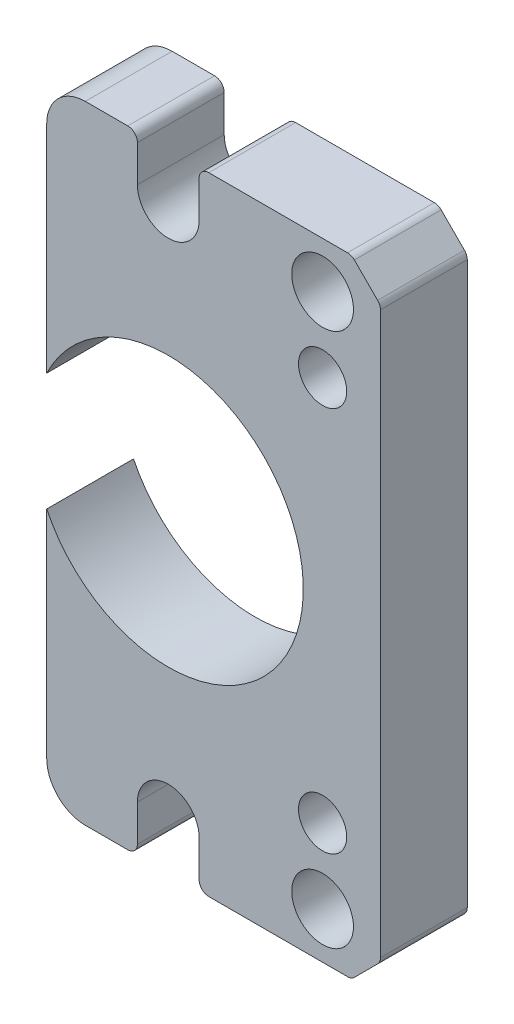
ISO-10303-21;
HEADER;
FILE_DESCRIPTION(('STEP AP214'),'2;1');
FILE_NAME('part.step','',(''),(''),'','','');
FILE_SCHEMA(('AUTOMOTIVE_DESIGN { 1 0 10303 214 1 1 1 1 }'));
ENDSEC;
DATA;
#1=APPLICATION_CONTEXT('core data for automotive mechanical design processes');
#2=APPLICATION_PROTOCOL_DEFINITION('international standard','automotive_design',2000,#1);
#3=PRODUCT_CONTEXT('',#1,'mechanical');
#4=PRODUCT('Part','Part','',(#3));
#5=PRODUCT_RELATED_PRODUCT_CATEGORY('part','',(#4));
#6=PRODUCT_DEFINITION_FORMATION('','',#4);
#7=PRODUCT_DEFINITION_CONTEXT('part definition',#1,'design');
#8=PRODUCT_DEFINITION('design','',#6,#7);
#9=PRODUCT_DEFINITION_SHAPE('','',#8);
#10=(LENGTH_UNIT() NAMED_UNIT(*) SI_UNIT(.MILLI.,.METRE.));
#11=(NAMED_UNIT(*) PLANE_ANGLE_UNIT() SI_UNIT($,.RADIAN.));
#12=(NAMED_UNIT(*) SI_UNIT($,.STERADIAN.) SOLID_ANGLE_UNIT());
#13=UNCERTAINTY_MEASURE_WITH_UNIT(LENGTH_MEASURE(1.E-05),#10,'distance_accuracy_value','');
#14=(GEOMETRIC_REPRESENTATION_CONTEXT(3) GLOBAL_UNCERTAINTY_ASSIGNED_CONTEXT((#13)) GLOBAL_UNIT_ASSIGNED_CONTEXT((#10,
#11,#12)) REPRESENTATION_CONTEXT('',''));
#15=CARTESIAN_POINT('',(0.,0.,0.));
#16=DIRECTION('',(0.,0.,1.));
#17=DIRECTION('',(1.,0.,0.));
#18=AXIS2_PLACEMENT_3D('',#15,#16,#17);
#19=CARTESIAN_POINT('',(10.5,-14.5428932188134,0.));
#20=DIRECTION('',(0.,0.,-1.));
#21=DIRECTION('',(-1.,0.,0.));
#22=AXIS2_PLACEMENT_3D('',#19,#20,#21);
#23=CYLINDRICAL_SURFACE('',#22,0.500000000000017);
#24=CARTESIAN_POINT('',(10.5,-14.5428932188134,-4.5));
#25=DIRECTION('',(0.,0.,-1.));
#26=DIRECTION('',(-1.,0.,0.));
#27=AXIS2_PLACEMENT_3D('',#24,#25,#26);
#28=CIRCLE('',#27,0.500000000000017);
#29=CARTESIAN_POINT('',(11.,-14.5428932188134,-4.5));
#30=VERTEX_POINT('',#29);
#31=CARTESIAN_POINT('',(10.8535533905933,-14.8964466094067,-4.5));
#32=VERTEX_POINT('',#31);
#33=EDGE_CURVE('E258',#30,#32,#28,.T.);
#34=ORIENTED_EDGE('',*,*,#33,.F.);
#35=DIRECTION('',(0.,0.,-1.));
#36=VECTOR('',#35,1.);
#37=CARTESIAN_POINT('',(11.,-14.5428932188134,0.));
#38=LINE('',#37,#36);
#39=CARTESIAN_POINT('',(11.,-14.5428932188134,0.));
#40=VERTEX_POINT('',#39);
#41=EDGE_CURVE('E215',#40,#30,#38,.T.);
#42=ORIENTED_EDGE('',*,*,#41,.F.);
#43=CARTESIAN_POINT('',(10.5,-14.5428932188134,0.));
#44=DIRECTION('',(0.,0.,-1.));
#45=DIRECTION('',(-1.,0.,0.));
#46=AXIS2_PLACEMENT_3D('',#43,#44,#45);
#47=CIRCLE('',#46,0.500000000000017);
#48=CARTESIAN_POINT('',(10.8535533905933,-14.8964466094067,0.));
#49=VERTEX_POINT('',#48);
#50=EDGE_CURVE('E261',#40,#49,#47,.T.);
#51=ORIENTED_EDGE('',*,*,#50,.T.);
#52=DIRECTION('',(0.,0.,-1.));
#53=VECTOR('',#52,1.);
#54=CARTESIAN_POINT('',(10.8535533905933,-14.8964466094067,0.));
#55=LINE('',#54,#53);
#56=EDGE_CURVE('E324',#49,#32,#55,.T.);
#57=ORIENTED_EDGE('',*,*,#56,.T.);
#58=EDGE_LOOP('',(#34,#42,#51,#57));
#59=FACE_BOUND('',#58,.T.);
#60=ADVANCED_FACE('F35',(#59),#23,.T.);
#61=CARTESIAN_POINT('',(11.,14.5428932188134,0.));
#62=DIRECTION('',(1.,0.,0.));
#63=DIRECTION('',(0.,0.,-1.));
#64=AXIS2_PLACEMENT_3D('',#61,#62,#63);
#65=PLANE('',#64);
#66=DIRECTION('',(0.,-1.,0.));
#67=VECTOR('',#66,1.);
#68=CARTESIAN_POINT('',(11.,14.5428932188134,-4.5));
#69=LINE('',#68,#67);
#70=CARTESIAN_POINT('',(11.,14.5428932188134,-4.5));
#71=VERTEX_POINT('',#70);
#72=EDGE_CURVE('E265',#71,#30,#69,.T.);
#73=ORIENTED_EDGE('',*,*,#72,.F.);
#74=DIRECTION('',(0.,0.,-1.));
#75=VECTOR('',#74,1.);
#76=CARTESIAN_POINT('',(11.,14.5428932188134,0.));
#77=LINE('',#76,#75);
#78=CARTESIAN_POINT('',(11.,14.5428932188134,0.));
#79=VERTEX_POINT('',#78);
#80=EDGE_CURVE('E386',#79,#71,#77,.T.);
#81=ORIENTED_EDGE('',*,*,#80,.F.);
#82=DIRECTION('',(0.,-1.,0.));
#83=VECTOR('',#82,1.);
#84=CARTESIAN_POINT('',(11.,14.5428932188134,0.));
#85=LINE('',#84,#83);
#86=EDGE_CURVE('E321',#79,#40,#85,.T.);
#87=ORIENTED_EDGE('',*,*,#86,.T.);
#88=ORIENTED_EDGE('',*,*,#41,.T.);
#89=EDGE_LOOP('',(#73,#81,#87,#88));
#90=FACE_BOUND('',#89,.T.);
#91=ADVANCED_FACE('F482',(#90),#65,.T.);
#92=CARTESIAN_POINT('',(10.5,14.5428932188134,0.));
#93=DIRECTION('',(0.,0.,-1.));
#94=DIRECTION('',(-1.,0.,0.));
#95=AXIS2_PLACEMENT_3D('',#92,#93,#94);
#96=CYLINDRICAL_SURFACE('',#95,0.500000000000017);
#97=CARTESIAN_POINT('',(10.5,14.5428932188134,-4.5));
#98=DIRECTION('',(0.,0.,-1.));
#99=DIRECTION('',(-1.,0.,0.));
#100=AXIS2_PLACEMENT_3D('',#97,#98,#99);
#101=CIRCLE('',#100,0.500000000000017);
#102=CARTESIAN_POINT('',(10.8535533905933,14.8964466094067,-4.5));
#103=VERTEX_POINT('',#102);
#104=EDGE_CURVE('E380',#103,#71,#101,.T.);
#105=ORIENTED_EDGE('',*,*,#104,.F.);
#106=DIRECTION('',(0.,0.,-1.));
#107=VECTOR('',#106,1.);
#108=CARTESIAN_POINT('',(10.8535533905933,14.8964466094067,0.));
#109=LINE('',#108,#107);
#110=CARTESIAN_POINT('',(10.8535533905933,14.8964466094067,0.));
#111=VERTEX_POINT('',#110);
#112=EDGE_CURVE('E388',#111,#103,#109,.T.);
#113=ORIENTED_EDGE('',*,*,#112,.F.);
#114=CARTESIAN_POINT('',(10.5,14.5428932188134,0.));
#115=DIRECTION('',(0.,0.,-1.));
#116=DIRECTION('',(-1.,0.,0.));
#117=AXIS2_PLACEMENT_3D('',#114,#115,#116);
#118=CIRCLE('',#117,0.500000000000017);
#119=EDGE_CURVE('E318',#111,#79,#118,.T.);
#120=ORIENTED_EDGE('',*,*,#119,.T.);
#121=ORIENTED_EDGE('',*,*,#80,.T.);
#122=EDGE_LOOP('',(#105,#113,#120,#121));
#123=FACE_BOUND('',#122,.T.);
#124=ADVANCED_FACE('F479',(#123),#96,.T.);
#125=CARTESIAN_POINT('',(9.64644660940672,16.1035533905933,0.));
#126=DIRECTION('',(0.707106781186554,0.707106781186541,0.));
#127=DIRECTION('',(-0.707106781186541,0.707106781186554,0.));
#128=AXIS2_PLACEMENT_3D('',#125,#126,#127);
#129=PLANE('',#128);
#130=DIRECTION('',(0.707106781186541,-0.707106781186554,0.));
#131=VECTOR('',#130,1.);
#132=CARTESIAN_POINT('',(9.64644660940672,16.1035533905933,-4.5));
#133=LINE('',#132,#131);
#134=CARTESIAN_POINT('',(9.64644660940672,16.1035533905933,-4.5));
#135=VERTEX_POINT('',#134);
#136=EDGE_CURVE('E377',#135,#103,#133,.T.);
#137=ORIENTED_EDGE('',*,*,#136,.F.);
#138=DIRECTION('',(0.,0.,-1.));
#139=VECTOR('',#138,1.);
#140=CARTESIAN_POINT('',(9.64644660940672,16.1035533905933,0.));
#141=LINE('',#140,#139);
#142=CARTESIAN_POINT('',(9.64644660940672,16.1035533905933,0.));
#143=VERTEX_POINT('',#142);
#144=EDGE_CURVE('E390',#143,#135,#141,.T.);
#145=ORIENTED_EDGE('',*,*,#144,.F.);
#146=DIRECTION('',(0.707106781186541,-0.707106781186554,0.));
#147=VECTOR('',#146,1.);
#148=CARTESIAN_POINT('',(9.64644660940672,16.1035533905933,0.));
#149=LINE('',#148,#147);
#150=EDGE_CURVE('E315',#143,#111,#149,.T.);
#151=ORIENTED_EDGE('',*,*,#150,.T.);
#152=ORIENTED_EDGE('',*,*,#112,.T.);
#153=EDGE_LOOP('',(#137,#145,#151,#152));
#154=FACE_BOUND('',#153,.T.);
#155=ADVANCED_FACE('F475',(#154),#129,.T.);
#156=CARTESIAN_POINT('',(9.29289321881345,15.75,0.));
#157=DIRECTION('',(0.,0.,-1.));
#158=DIRECTION('',(-1.,0.,0.));
#159=AXIS2_PLACEMENT_3D('',#156,#157,#158);
#160=CYLINDRICAL_SURFACE('',#159,0.500000000000008);
#161=CARTESIAN_POINT('',(9.29289321881345,15.75,-4.5));
#162=DIRECTION('',(0.,0.,-1.));
#163=DIRECTION('',(-1.,0.,0.));
#164=AXIS2_PLACEMENT_3D('',#161,#162,#163);
#165=CIRCLE('',#164,0.500000000000008);
#166=CARTESIAN_POINT('',(9.29289321881345,16.25,-4.5));
#167=VERTEX_POINT('',#166);
#168=EDGE_CURVE('E374',#167,#135,#165,.T.);
#169=ORIENTED_EDGE('',*,*,#168,.F.);
#170=DIRECTION('',(0.,0.,-1.));
#171=VECTOR('',#170,1.);
#172=CARTESIAN_POINT('',(9.29289321881345,16.25,0.));
#173=LINE('',#172,#171);
#174=CARTESIAN_POINT('',(9.29289321881345,16.25,0.));
#175=VERTEX_POINT('',#174);
#176=EDGE_CURVE('E392',#175,#167,#173,.T.);
#177=ORIENTED_EDGE('',*,*,#176,.F.);
#178=CARTESIAN_POINT('',(9.29289321881345,15.75,0.));
#179=DIRECTION('',(0.,0.,-1.));
#180=DIRECTION('',(-1.,0.,0.));
#181=AXIS2_PLACEMENT_3D('',#178,#179,#180);
#182=CIRCLE('',#181,0.500000000000008);
#183=EDGE_CURVE('E312',#175,#143,#182,.T.);
#184=ORIENTED_EDGE('',*,*,#183,.T.);
#185=ORIENTED_EDGE('',*,*,#144,.T.);
#186=EDGE_LOOP('',(#169,#177,#184,#185));
#187=FACE_BOUND('',#186,.T.);
#188=ADVANCED_FACE('F470',(#187),#160,.T.);
#189=CARTESIAN_POINT('',(2.1,16.25,0.));
#190=DIRECTION('',(0.,1.,0.));
#191=DIRECTION('',(0.,0.,1.));
#192=AXIS2_PLACEMENT_3D('',#189,#190,#191);
#193=PLANE('',#192);
#194=DIRECTION('',(1.,0.,0.));
#195=VECTOR('',#194,1.);
#196=CARTESIAN_POINT('',(2.1,16.25,-4.5));
#197=LINE('',#196,#195);
#198=CARTESIAN_POINT('',(2.1,16.25,-4.5));
#199=VERTEX_POINT('',#198);
#200=EDGE_CURVE('E371',#199,#167,#197,.T.);
#201=ORIENTED_EDGE('',*,*,#200,.F.);
#202=DIRECTION('',(0.,0.,-1.));
#203=VECTOR('',#202,1.);
#204=CARTESIAN_POINT('',(2.1,16.25,0.));
#205=LINE('',#204,#203);
#206=CARTESIAN_POINT('',(2.1,16.25,0.));
#207=VERTEX_POINT('',#206);
#208=EDGE_CURVE('E394',#207,#199,#205,.T.);
#209=ORIENTED_EDGE('',*,*,#208,.F.);
#210=DIRECTION('',(1.,0.,0.));
#211=VECTOR('',#210,1.);
#212=CARTESIAN_POINT('',(2.1,16.25,0.));
#213=LINE('',#212,#211);
#214=EDGE_CURVE('E309',#207,#175,#213,.T.);
#215=ORIENTED_EDGE('',*,*,#214,.T.);
#216=ORIENTED_EDGE('',*,*,#176,.T.);
#217=EDGE_LOOP('',(#201,#209,#215,#216));
#218=FACE_BOUND('',#217,.T.);
#219=ADVANCED_FACE('F466',(#218),#193,.T.);
#220=CARTESIAN_POINT('',(2.1,15.75,0.));
#221=DIRECTION('',(0.,0.,-1.));
#222=DIRECTION('',(-1.,0.,0.));
#223=AXIS2_PLACEMENT_3D('',#220,#221,#222);
#224=CYLINDRICAL_SURFACE('',#223,0.5);
#225=CARTESIAN_POINT('',(2.1,15.75,-4.5));
#226=DIRECTION('',(0.,0.,-1.));
#227=DIRECTION('',(-1.,0.,0.));
#228=AXIS2_PLACEMENT_3D('',#225,#226,#227);
#229=CIRCLE('',#228,0.5);
#230=CARTESIAN_POINT('',(1.6,15.75,-4.5));
#231=VERTEX_POINT('',#230);
#232=EDGE_CURVE('E368',#231,#199,#229,.T.);
#233=ORIENTED_EDGE('',*,*,#232,.F.);
#234=DIRECTION('',(0.,0.,-1.));
#235=VECTOR('',#234,1.);
#236=CARTESIAN_POINT('',(1.6,15.75,0.));
#237=LINE('',#236,#235);
#238=CARTESIAN_POINT('',(1.6,15.75,0.));
#239=VERTEX_POINT('',#238);
#240=EDGE_CURVE('E396',#239,#231,#237,.T.);
#241=ORIENTED_EDGE('',*,*,#240,.F.);
#242=CARTESIAN_POINT('',(2.1,15.75,0.));
#243=DIRECTION('',(0.,0.,-1.));
#244=DIRECTION('',(-1.,0.,0.));
#245=AXIS2_PLACEMENT_3D('',#242,#243,#244);
#246=CIRCLE('',#245,0.5);
#247=EDGE_CURVE('E306',#239,#207,#246,.T.);
#248=ORIENTED_EDGE('',*,*,#247,.T.);
#249=ORIENTED_EDGE('',*,*,#208,.T.);
#250=EDGE_LOOP('',(#233,#241,#248,#249));
#251=FACE_BOUND('',#250,.T.);
#252=ADVANCED_FACE('F462',(#251),#224,.T.);
#253=CARTESIAN_POINT('',(1.6,13.856406460551,0.));
#254=DIRECTION('',(-1.,0.,0.));
#255=DIRECTION('',(0.,0.,1.));
#256=AXIS2_PLACEMENT_3D('',#253,#254,#255);
#257=PLANE('',#256);
#258=DIRECTION('',(0.,1.,0.));
#259=VECTOR('',#258,1.);
#260=CARTESIAN_POINT('',(1.6,13.856406460551,-4.5));
#261=LINE('',#260,#259);
#262=CARTESIAN_POINT('',(1.6,13.856406460551,-4.5));
#263=VERTEX_POINT('',#262);
#264=EDGE_CURVE('E365',#263,#231,#261,.T.);
#265=ORIENTED_EDGE('',*,*,#264,.F.);
#266=DIRECTION('',(0.,0.,-1.));
#267=VECTOR('',#266,1.);
#268=CARTESIAN_POINT('',(1.6,13.856406460551,0.));
#269=LINE('',#268,#267);
#270=CARTESIAN_POINT('',(1.6,13.856406460551,0.));
#271=VERTEX_POINT('',#270);
#272=EDGE_CURVE('E398',#271,#263,#269,.T.);
#273=ORIENTED_EDGE('',*,*,#272,.F.);
#274=DIRECTION('',(0.,1.,0.));
#275=VECTOR('',#274,1.);
#276=CARTESIAN_POINT('',(1.6,13.856406460551,0.));
#277=LINE('',#276,#275);
#278=EDGE_CURVE('E303',#271,#239,#277,.T.);
#279=ORIENTED_EDGE('',*,*,#278,.T.);
#280=ORIENTED_EDGE('',*,*,#240,.T.);
#281=EDGE_LOOP('',(#265,#273,#279,#280));
#282=FACE_BOUND('',#281,.T.);
#283=ADVANCED_FACE('F458',(#282),#257,.T.);
#284=CARTESIAN_POINT('',(0.,13.856406460551,0.));
#285=DIRECTION('',(0.,0.,-1.));
#286=DIRECTION('',(-1.,0.,0.));
#287=AXIS2_PLACEMENT_3D('',#284,#285,#286);
#288=CYLINDRICAL_SURFACE('',#287,1.6);
#289=CARTESIAN_POINT('',(0.,13.856406460551,-4.5));
#290=DIRECTION('',(0.,0.,1.));
#291=DIRECTION('',(1.,0.,0.));
#292=AXIS2_PLACEMENT_3D('',#289,#290,#291);
#293=CIRCLE('',#292,1.6);
#294=CARTESIAN_POINT('',(-1.6,13.856406460551,-4.5));
#295=VERTEX_POINT('',#294);
#296=EDGE_CURVE('E362',#295,#263,#293,.T.);
#297=ORIENTED_EDGE('',*,*,#296,.F.);
#298=DIRECTION('',(0.,0.,-1.));
#299=VECTOR('',#298,1.);
#300=CARTESIAN_POINT('',(-1.6,13.856406460551,0.));
#301=LINE('',#300,#299);
#302=CARTESIAN_POINT('',(-1.6,13.856406460551,0.));
#303=VERTEX_POINT('',#302);
#304=EDGE_CURVE('E400',#303,#295,#301,.T.);
#305=ORIENTED_EDGE('',*,*,#304,.F.);
#306=CARTESIAN_POINT('',(0.,13.856406460551,0.));
#307=DIRECTION('',(0.,0.,1.));
#308=DIRECTION('',(1.,0.,0.));
#309=AXIS2_PLACEMENT_3D('',#306,#307,#308);
#310=CIRCLE('',#309,1.6);
#311=EDGE_CURVE('E300',#303,#271,#310,.T.);
#312=ORIENTED_EDGE('',*,*,#311,.T.);
#313=ORIENTED_EDGE('',*,*,#272,.T.);
#314=EDGE_LOOP('',(#297,#305,#312,#313));
#315=FACE_BOUND('',#314,.T.);
#316=ADVANCED_FACE('F454',(#315),#288,.F.);
#317=CARTESIAN_POINT('',(-1.6,15.75,0.));
#318=DIRECTION('',(1.,0.,0.));
#319=DIRECTION('',(0.,0.,-1.));
#320=AXIS2_PLACEMENT_3D('',#317,#318,#319);
#321=PLANE('',#320);
#322=DIRECTION('',(0.,-1.,0.));
#323=VECTOR('',#322,1.);
#324=CARTESIAN_POINT('',(-1.6,15.75,-4.5));
#325=LINE('',#324,#323);
#326=CARTESIAN_POINT('',(-1.6,15.75,-4.5));
#327=VERTEX_POINT('',#326);
#328=EDGE_CURVE('E359',#327,#295,#325,.T.);
#329=ORIENTED_EDGE('',*,*,#328,.F.);
#330=DIRECTION('',(0.,0.,-1.));
#331=VECTOR('',#330,1.);
#332=CARTESIAN_POINT('',(-1.6,15.75,0.));
#333=LINE('',#332,#331);
#334=CARTESIAN_POINT('',(-1.6,15.75,0.));
#335=VERTEX_POINT('',#334);
#336=EDGE_CURVE('E402',#335,#327,#333,.T.);
#337=ORIENTED_EDGE('',*,*,#336,.F.);
#338=DIRECTION('',(0.,-1.,0.));
#339=VECTOR('',#338,1.);
#340=CARTESIAN_POINT('',(-1.6,15.75,0.));
#341=LINE('',#340,#339);
#342=EDGE_CURVE('E297',#335,#303,#341,.T.);
#343=ORIENTED_EDGE('',*,*,#342,.T.);
#344=ORIENTED_EDGE('',*,*,#304,.T.);
#345=EDGE_LOOP('',(#329,#337,#343,#344));
#346=FACE_BOUND('',#345,.T.);
#347=ADVANCED_FACE('F452',(#346),#321,.T.);
#348=CARTESIAN_POINT('',(-2.1,15.75,0.));
#349=DIRECTION('',(0.,0.,-1.));
#350=DIRECTION('',(-1.,0.,0.));
#351=AXIS2_PLACEMENT_3D('',#348,#349,#350);
#352=CYLINDRICAL_SURFACE('',#351,0.5);
#353=CARTESIAN_POINT('',(-2.1,15.75,-4.5));
#354=DIRECTION('',(0.,0.,-1.));
#355=DIRECTION('',(-1.,0.,0.));
#356=AXIS2_PLACEMENT_3D('',#353,#354,#355);
#357=CIRCLE('',#356,0.5);
#358=CARTESIAN_POINT('',(-2.1,16.25,-4.5));
#359=VERTEX_POINT('',#358);
#360=EDGE_CURVE('E356',#359,#327,#357,.T.);
#361=ORIENTED_EDGE('',*,*,#360,.F.);
#362=DIRECTION('',(0.,0.,-1.));
#363=VECTOR('',#362,1.);
#364=CARTESIAN_POINT('',(-2.1,16.25,0.));
#365=LINE('',#364,#363);
#366=CARTESIAN_POINT('',(-2.1,16.25,0.));
#367=VERTEX_POINT('',#366);
#368=EDGE_CURVE('E404',#367,#359,#365,.T.);
#369=ORIENTED_EDGE('',*,*,#368,.F.);
#370=CARTESIAN_POINT('',(-2.1,15.75,0.));
#371=DIRECTION('',(0.,0.,-1.));
#372=DIRECTION('',(-1.,0.,0.));
#373=AXIS2_PLACEMENT_3D('',#370,#371,#372);
#374=CIRCLE('',#373,0.5);
#375=EDGE_CURVE('E294',#367,#335,#374,.T.);
#376=ORIENTED_EDGE('',*,*,#375,.T.);
#377=ORIENTED_EDGE('',*,*,#336,.T.);
#378=EDGE_LOOP('',(#361,#369,#376,#377));
#379=FACE_BOUND('',#378,.T.);
#380=ADVANCED_FACE('F446',(#379),#352,.T.);
#381=CARTESIAN_POINT('',(-9.29289321881346,16.25,0.));
#382=DIRECTION('',(0.,1.,0.));
#383=DIRECTION('',(0.,0.,1.));
#384=AXIS2_PLACEMENT_3D('',#381,#382,#383);
#385=PLANE('',#384);
#386=DIRECTION('',(1.,0.,0.));
#387=VECTOR('',#386,1.);
#388=CARTESIAN_POINT('',(-9.29289321881346,16.25,-4.5));
#389=LINE('',#388,#387);
#390=CARTESIAN_POINT('',(-4.30090089148444,16.25,-4.5));
#391=VERTEX_POINT('',#390);
#392=EDGE_CURVE('E354',#391,#359,#389,.T.);
#393=ORIENTED_EDGE('',*,*,#392,.F.);
#394=DIRECTION('',(0.,0.,1.));
#395=VECTOR('',#394,1.);
#396=CARTESIAN_POINT('',(-4.30090089148444,16.25,0.));
#397=LINE('',#396,#395);
#398=CARTESIAN_POINT('',(-4.30090089148444,16.25,0.));
#399=VERTEX_POINT('',#398);
#400=EDGE_CURVE('E43',#391,#399,#397,.T.);
#401=ORIENTED_EDGE('',*,*,#400,.T.);
#402=DIRECTION('',(1.,0.,0.));
#403=VECTOR('',#402,1.);
#404=CARTESIAN_POINT('',(-9.29289321881346,16.25,0.));
#405=LINE('',#404,#403);
#406=EDGE_CURVE('E292',#399,#367,#405,.T.);
#407=ORIENTED_EDGE('',*,*,#406,.T.);
#408=ORIENTED_EDGE('',*,*,#368,.T.);
#409=EDGE_LOOP('',(#393,#401,#407,#408));
#410=FACE_BOUND('',#409,.T.);
#411=ADVANCED_FACE('F438',(#410),#385,.T.);
#412=CARTESIAN_POINT('',(-2.1,-16.25,0.));
#413=DIRECTION('',(0.,-1.,0.));
#414=DIRECTION('',(0.,0.,-1.));
#415=AXIS2_PLACEMENT_3D('',#412,#413,#414);
#416=PLANE('',#415);
#417=DIRECTION('',(-1.,0.,0.));
#418=VECTOR('',#417,1.);
#419=CARTESIAN_POINT('',(-2.1,-16.25,0.));
#420=LINE('',#419,#418);
#421=CARTESIAN_POINT('',(-2.1,-16.25,0.));
#422=VERTEX_POINT('',#421);
#423=CARTESIAN_POINT('',(-4.30090089148444,-16.25,0.));
#424=VERTEX_POINT('',#423);
#425=EDGE_CURVE('E289',#422,#424,#420,.T.);
#426=ORIENTED_EDGE('',*,*,#425,.T.);
#427=DIRECTION('',(0.,0.,1.));
#428=VECTOR('',#427,1.);
#429=CARTESIAN_POINT('',(-4.30090089148444,-16.25,-4.5));
#430=LINE('',#429,#428);
#431=CARTESIAN_POINT('',(-4.30090089148444,-16.25,-4.5));
#432=VERTEX_POINT('',#431);
#433=EDGE_CURVE('E431',#424,#432,#430,.F.);
#434=ORIENTED_EDGE('',*,*,#433,.T.);
#435=DIRECTION('',(-1.,0.,0.));
#436=VECTOR('',#435,1.);
#437=CARTESIAN_POINT('',(-2.1,-16.25,-4.5));
#438=LINE('',#437,#436);
#439=CARTESIAN_POINT('',(-2.1,-16.25,-4.5));
#440=VERTEX_POINT('',#439);
#441=EDGE_CURVE('E351',#440,#432,#438,.T.);
#442=ORIENTED_EDGE('',*,*,#441,.F.);
#443=DIRECTION('',(0.,0.,-1.));
#444=VECTOR('',#443,1.);
#445=CARTESIAN_POINT('',(-2.1,-16.25,0.));
#446=LINE('',#445,#444);
#447=EDGE_CURVE('E407',#422,#440,#446,.T.);
#448=ORIENTED_EDGE('',*,*,#447,.F.);
#449=EDGE_LOOP('',(#426,#434,#442,#448));
#450=FACE_BOUND('',#449,.T.);
#451=ADVANCED_FACE('F556',(#450),#416,.T.);
#452=CARTESIAN_POINT('',(-2.1,-15.75,0.));
#453=DIRECTION('',(0.,0.,-1.));
#454=DIRECTION('',(-1.,0.,0.));
#455=AXIS2_PLACEMENT_3D('',#452,#453,#454);
#456=CYLINDRICAL_SURFACE('',#455,0.5);
#457=CARTESIAN_POINT('',(-2.1,-15.75,-4.5));
#458=DIRECTION('',(0.,0.,-1.));
#459=DIRECTION('',(-1.,0.,0.));
#460=AXIS2_PLACEMENT_3D('',#457,#458,#459);
#461=CIRCLE('',#460,0.5);
#462=CARTESIAN_POINT('',(-1.6,-15.75,-4.5));
#463=VERTEX_POINT('',#462);
#464=EDGE_CURVE('E348',#463,#440,#461,.T.);
#465=ORIENTED_EDGE('',*,*,#464,.F.);
#466=DIRECTION('',(0.,0.,-1.));
#467=VECTOR('',#466,1.);
#468=CARTESIAN_POINT('',(-1.6,-15.75,0.));
#469=LINE('',#468,#467);
#470=CARTESIAN_POINT('',(-1.6,-15.75,0.));
#471=VERTEX_POINT('',#470);
#472=EDGE_CURVE('E409',#471,#463,#469,.T.);
#473=ORIENTED_EDGE('',*,*,#472,.F.);
#474=CARTESIAN_POINT('',(-2.1,-15.75,0.));
#475=DIRECTION('',(0.,0.,-1.));
#476=DIRECTION('',(-1.,0.,0.));
#477=AXIS2_PLACEMENT_3D('',#474,#475,#476);
#478=CIRCLE('',#477,0.5);
#479=EDGE_CURVE('E286',#471,#422,#478,.T.);
#480=ORIENTED_EDGE('',*,*,#479,.T.);
#481=ORIENTED_EDGE('',*,*,#447,.T.);
#482=EDGE_LOOP('',(#465,#473,#480,#481));
#483=FACE_BOUND('',#482,.T.);
#484=ADVANCED_FACE('F517',(#483),#456,.T.);
#485=CARTESIAN_POINT('',(-1.6,-13.856406460551,0.));
#486=DIRECTION('',(1.,0.,0.));
#487=DIRECTION('',(0.,0.,-1.));
#488=AXIS2_PLACEMENT_3D('',#485,#486,#487);
#489=PLANE('',#488);
#490=DIRECTION('',(0.,-1.,0.));
#491=VECTOR('',#490,1.);
#492=CARTESIAN_POINT('',(-1.6,-13.856406460551,-4.5));
#493=LINE('',#492,#491);
#494=CARTESIAN_POINT('',(-1.6,-13.856406460551,-4.5));
#495=VERTEX_POINT('',#494);
#496=EDGE_CURVE('E345',#495,#463,#493,.T.);
#497=ORIENTED_EDGE('',*,*,#496,.F.);
#498=DIRECTION('',(0.,0.,-1.));
#499=VECTOR('',#498,1.);
#500=CARTESIAN_POINT('',(-1.6,-13.856406460551,0.));
#501=LINE('',#500,#499);
#502=CARTESIAN_POINT('',(-1.6,-13.856406460551,0.));
#503=VERTEX_POINT('',#502);
#504=EDGE_CURVE('E411',#503,#495,#501,.T.);
#505=ORIENTED_EDGE('',*,*,#504,.F.);
#506=DIRECTION('',(0.,-1.,0.));
#507=VECTOR('',#506,1.);
#508=CARTESIAN_POINT('',(-1.6,-13.856406460551,0.));
#509=LINE('',#508,#507);
#510=EDGE_CURVE('E283',#503,#471,#509,.T.);
#511=ORIENTED_EDGE('',*,*,#510,.T.);
#512=ORIENTED_EDGE('',*,*,#472,.T.);
#513=EDGE_LOOP('',(#497,#505,#511,#512));
#514=FACE_BOUND('',#513,.T.);
#515=ADVANCED_FACE('F513',(#514),#489,.T.);
#516=CARTESIAN_POINT('',(0.,-13.856406460551,0.));
#517=DIRECTION('',(0.,0.,-1.));
#518=DIRECTION('',(-1.,0.,0.));
#519=AXIS2_PLACEMENT_3D('',#516,#517,#518);
#520=CYLINDRICAL_SURFACE('',#519,1.6);
#521=CARTESIAN_POINT('',(0.,-13.856406460551,-4.5));
#522=DIRECTION('',(0.,0.,1.));
#523=DIRECTION('',(1.,0.,0.));
#524=AXIS2_PLACEMENT_3D('',#521,#522,#523);
#525=CIRCLE('',#524,1.6);
#526=CARTESIAN_POINT('',(1.6,-13.856406460551,-4.5));
#527=VERTEX_POINT('',#526);
#528=EDGE_CURVE('E342',#527,#495,#525,.T.);
#529=ORIENTED_EDGE('',*,*,#528,.F.);
#530=DIRECTION('',(0.,0.,-1.));
#531=VECTOR('',#530,1.);
#532=CARTESIAN_POINT('',(1.6,-13.856406460551,0.));
#533=LINE('',#532,#531);
#534=CARTESIAN_POINT('',(1.6,-13.856406460551,0.));
#535=VERTEX_POINT('',#534);
#536=EDGE_CURVE('E413',#535,#527,#533,.T.);
#537=ORIENTED_EDGE('',*,*,#536,.F.);
#538=CARTESIAN_POINT('',(0.,-13.856406460551,0.));
#539=DIRECTION('',(0.,0.,1.));
#540=DIRECTION('',(1.,0.,0.));
#541=AXIS2_PLACEMENT_3D('',#538,#539,#540);
#542=CIRCLE('',#541,1.6);
#543=EDGE_CURVE('E280',#535,#503,#542,.T.);
#544=ORIENTED_EDGE('',*,*,#543,.T.);
#545=ORIENTED_EDGE('',*,*,#504,.T.);
#546=EDGE_LOOP('',(#529,#537,#544,#545));
#547=FACE_BOUND('',#546,.T.);
#548=ADVANCED_FACE('F509',(#547),#520,.F.);
#549=CARTESIAN_POINT('',(1.6,-15.75,0.));
#550=DIRECTION('',(-1.,0.,0.));
#551=DIRECTION('',(0.,0.,1.));
#552=AXIS2_PLACEMENT_3D('',#549,#550,#551);
#553=PLANE('',#552);
#554=DIRECTION('',(0.,1.,0.));
#555=VECTOR('',#554,1.);
#556=CARTESIAN_POINT('',(1.6,-15.75,-4.5));
#557=LINE('',#556,#555);
#558=CARTESIAN_POINT('',(1.6,-15.75,-4.5));
#559=VERTEX_POINT('',#558);
#560=EDGE_CURVE('E339',#559,#527,#557,.T.);
#561=ORIENTED_EDGE('',*,*,#560,.F.);
#562=DIRECTION('',(0.,0.,-1.));
#563=VECTOR('',#562,1.);
#564=CARTESIAN_POINT('',(1.6,-15.75,0.));
#565=LINE('',#564,#563);
#566=CARTESIAN_POINT('',(1.6,-15.75,0.));
#567=VERTEX_POINT('',#566);
#568=EDGE_CURVE('E415',#567,#559,#565,.T.);
#569=ORIENTED_EDGE('',*,*,#568,.F.);
#570=DIRECTION('',(0.,1.,0.));
#571=VECTOR('',#570,1.);
#572=CARTESIAN_POINT('',(1.6,-15.75,0.));
#573=LINE('',#572,#571);
#574=EDGE_CURVE('E277',#567,#535,#573,.T.);
#575=ORIENTED_EDGE('',*,*,#574,.T.);
#576=ORIENTED_EDGE('',*,*,#536,.T.);
#577=EDGE_LOOP('',(#561,#569,#575,#576));
#578=FACE_BOUND('',#577,.T.);
#579=ADVANCED_FACE('F505',(#578),#553,.T.);
#580=CARTESIAN_POINT('',(2.1,-15.75,0.));
#581=DIRECTION('',(0.,0.,-1.));
#582=DIRECTION('',(-1.,0.,0.));
#583=AXIS2_PLACEMENT_3D('',#580,#581,#582);
#584=CYLINDRICAL_SURFACE('',#583,0.5);
#585=CARTESIAN_POINT('',(2.1,-15.75,-4.5));
#586=DIRECTION('',(0.,0.,-1.));
#587=DIRECTION('',(-1.,0.,0.));
#588=AXIS2_PLACEMENT_3D('',#585,#586,#587);
#589=CIRCLE('',#588,0.5);
#590=CARTESIAN_POINT('',(2.1,-16.25,-4.5));
#591=VERTEX_POINT('',#590);
#592=EDGE_CURVE('E336',#591,#559,#589,.T.);
#593=ORIENTED_EDGE('',*,*,#592,.F.);
#594=DIRECTION('',(0.,0.,-1.));
#595=VECTOR('',#594,1.);
#596=CARTESIAN_POINT('',(2.1,-16.25,0.));
#597=LINE('',#596,#595);
#598=CARTESIAN_POINT('',(2.1,-16.25,0.));
#599=VERTEX_POINT('',#598);
#600=EDGE_CURVE('E417',#599,#591,#597,.T.);
#601=ORIENTED_EDGE('',*,*,#600,.F.);
#602=CARTESIAN_POINT('',(2.1,-15.75,0.));
#603=DIRECTION('',(0.,0.,-1.));
#604=DIRECTION('',(-1.,0.,0.));
#605=AXIS2_PLACEMENT_3D('',#602,#603,#604);
#606=CIRCLE('',#605,0.5);
#607=EDGE_CURVE('E274',#599,#567,#606,.T.);
#608=ORIENTED_EDGE('',*,*,#607,.T.);
#609=ORIENTED_EDGE('',*,*,#568,.T.);
#610=EDGE_LOOP('',(#593,#601,#608,#609));
#611=FACE_BOUND('',#610,.T.);
#612=ADVANCED_FACE('F501',(#611),#584,.T.);
#613=CARTESIAN_POINT('',(9.29289321881345,-16.25,0.));
#614=DIRECTION('',(0.,-1.,0.));
#615=DIRECTION('',(0.,0.,-1.));
#616=AXIS2_PLACEMENT_3D('',#613,#614,#615);
#617=PLANE('',#616);
#618=DIRECTION('',(-1.,0.,0.));
#619=VECTOR('',#618,1.);
#620=CARTESIAN_POINT('',(9.29289321881345,-16.25,-4.5));
#621=LINE('',#620,#619);
#622=CARTESIAN_POINT('',(9.29289321881345,-16.25,-4.5));
#623=VERTEX_POINT('',#622);
#624=EDGE_CURVE('E333',#623,#591,#621,.T.);
#625=ORIENTED_EDGE('',*,*,#624,.F.);
#626=DIRECTION('',(0.,0.,-1.));
#627=VECTOR('',#626,1.);
#628=CARTESIAN_POINT('',(9.29289321881345,-16.25,0.));
#629=LINE('',#628,#627);
#630=CARTESIAN_POINT('',(9.29289321881345,-16.25,0.));
#631=VERTEX_POINT('',#630);
#632=EDGE_CURVE('E419',#631,#623,#629,.T.);
#633=ORIENTED_EDGE('',*,*,#632,.F.);
#634=DIRECTION('',(-1.,0.,0.));
#635=VECTOR('',#634,1.);
#636=CARTESIAN_POINT('',(9.29289321881345,-16.25,0.));
#637=LINE('',#636,#635);
#638=EDGE_CURVE('E271',#631,#599,#637,.T.);
#639=ORIENTED_EDGE('',*,*,#638,.T.);
#640=ORIENTED_EDGE('',*,*,#600,.T.);
#641=EDGE_LOOP('',(#625,#633,#639,#640));
#642=FACE_BOUND('',#641,.T.);
#643=ADVANCED_FACE('F497',(#642),#617,.T.);
#644=CARTESIAN_POINT('',(9.29289321881345,-15.75,0.));
#645=DIRECTION('',(0.,0.,-1.));
#646=DIRECTION('',(-1.,0.,0.));
#647=AXIS2_PLACEMENT_3D('',#644,#645,#646);
#648=CYLINDRICAL_SURFACE('',#647,0.500000000000012);
#649=CARTESIAN_POINT('',(9.29289321881345,-15.75,-4.5));
#650=DIRECTION('',(0.,0.,-1.));
#651=DIRECTION('',(-1.,0.,0.));
#652=AXIS2_PLACEMENT_3D('',#649,#650,#651);
#653=CIRCLE('',#652,0.500000000000012);
#654=CARTESIAN_POINT('',(9.64644660940673,-16.1035533905933,-4.5));
#655=VERTEX_POINT('',#654);
#656=EDGE_CURVE('E330',#655,#623,#653,.T.);
#657=ORIENTED_EDGE('',*,*,#656,.F.);
#658=DIRECTION('',(0.,0.,-1.));
#659=VECTOR('',#658,1.);
#660=CARTESIAN_POINT('',(9.64644660940673,-16.1035533905933,0.));
#661=LINE('',#660,#659);
#662=CARTESIAN_POINT('',(9.64644660940673,-16.1035533905933,0.));
#663=VERTEX_POINT('',#662);
#664=EDGE_CURVE('E421',#663,#655,#661,.T.);
#665=ORIENTED_EDGE('',*,*,#664,.F.);
#666=CARTESIAN_POINT('',(9.29289321881345,-15.75,0.));
#667=DIRECTION('',(0.,0.,-1.));
#668=DIRECTION('',(-1.,0.,0.));
#669=AXIS2_PLACEMENT_3D('',#666,#667,#668);
#670=CIRCLE('',#669,0.500000000000012);
#671=EDGE_CURVE('E268',#663,#631,#670,.T.);
#672=ORIENTED_EDGE('',*,*,#671,.T.);
#673=ORIENTED_EDGE('',*,*,#632,.T.);
#674=EDGE_LOOP('',(#657,#665,#672,#673));
#675=FACE_BOUND('',#674,.T.);
#676=ADVANCED_FACE('F493',(#675),#648,.T.);
#677=CARTESIAN_POINT('',(10.8535533905933,-14.8964466094067,0.));
#678=DIRECTION('',(0.707106781186557,-0.707106781186538,0.));
#679=DIRECTION('',(0.707106781186538,0.707106781186557,0.));
#680=AXIS2_PLACEMENT_3D('',#677,#678,#679);
#681=PLANE('',#680);
#682=DIRECTION('',(-0.707106781186538,-0.707106781186557,0.));
#683=VECTOR('',#682,1.);
#684=CARTESIAN_POINT('',(10.8535533905933,-14.8964466094067,-4.5));
#685=LINE('',#684,#683);
#686=EDGE_CURVE('E327',#32,#655,#685,.T.);
#687=ORIENTED_EDGE('',*,*,#686,.F.);
#688=ORIENTED_EDGE('',*,*,#56,.F.);
#689=DIRECTION('',(-0.707106781186538,-0.707106781186557,0.));
#690=VECTOR('',#689,1.);
#691=CARTESIAN_POINT('',(10.8535533905933,-14.8964466094067,0.));
#692=LINE('',#691,#690);
#693=EDGE_CURVE('E264',#49,#663,#692,.T.);
#694=ORIENTED_EDGE('',*,*,#693,.T.);
#695=ORIENTED_EDGE('',*,*,#664,.T.);
#696=EDGE_LOOP('',(#687,#688,#694,#695));
#697=FACE_BOUND('',#696,.T.);
#698=ADVANCED_FACE('F489',(#697),#681,.T.);
#699=CARTESIAN_POINT('',(10.5,-14.5428932188134,0.));
#700=DIRECTION('',(0.,0.,-1.));
#701=DIRECTION('',(-1.,0.,0.));
#702=AXIS2_PLACEMENT_3D('',#699,#700,#701);
#703=PLANE('',#702);
#704=DIRECTION('',(0.,1.,0.));
#705=VECTOR('',#704,1.);
#706=CARTESIAN_POINT('',(-6.30090089148444,-16.25,0.));
#707=LINE('',#706,#705);
#708=CARTESIAN_POINT('',(-6.30090089148444,-14.25,0.));
#709=VERTEX_POINT('',#708);
#710=CARTESIAN_POINT('',(-6.30090089148444,-3.0493684519406,0.));
#711=VERTEX_POINT('',#710);
#712=EDGE_CURVE('E225',#709,#711,#707,.T.);
#713=ORIENTED_EDGE('',*,*,#712,.F.);
#714=CARTESIAN_POINT('',(-4.30090089148444,-14.25,0.));
#715=DIRECTION('',(0.,0.,-1.));
#716=DIRECTION('',(-1.,0.,0.));
#717=AXIS2_PLACEMENT_3D('',#714,#715,#716);
#718=CIRCLE('',#717,2.);
#719=EDGE_CURVE('E429',#709,#424,#718,.F.);
#720=ORIENTED_EDGE('',*,*,#719,.T.);
#721=ORIENTED_EDGE('',*,*,#425,.F.);
#722=ORIENTED_EDGE('',*,*,#479,.F.);
#723=ORIENTED_EDGE('',*,*,#510,.F.);
#724=ORIENTED_EDGE('',*,*,#543,.F.);
#725=ORIENTED_EDGE('',*,*,#574,.F.);
#726=ORIENTED_EDGE('',*,*,#607,.F.);
#727=ORIENTED_EDGE('',*,*,#638,.F.);
#728=ORIENTED_EDGE('',*,*,#671,.F.);
#729=ORIENTED_EDGE('',*,*,#693,.F.);
#730=ORIENTED_EDGE('',*,*,#50,.F.);
#731=ORIENTED_EDGE('',*,*,#86,.F.);
#732=ORIENTED_EDGE('',*,*,#119,.F.);
#733=ORIENTED_EDGE('',*,*,#150,.F.);
#734=ORIENTED_EDGE('',*,*,#183,.F.);
#735=ORIENTED_EDGE('',*,*,#214,.F.);
#736=ORIENTED_EDGE('',*,*,#247,.F.);
#737=ORIENTED_EDGE('',*,*,#278,.F.);
#738=ORIENTED_EDGE('',*,*,#311,.F.);
#739=ORIENTED_EDGE('',*,*,#342,.F.);
#740=ORIENTED_EDGE('',*,*,#375,.F.);
#741=ORIENTED_EDGE('',*,*,#406,.F.);
#742=CARTESIAN_POINT('',(-4.30090089148444,14.25,0.));
#743=DIRECTION('',(0.,0.,-1.));
#744=DIRECTION('',(-1.,0.,0.));
#745=AXIS2_PLACEMENT_3D('',#742,#743,#744);
#746=CIRCLE('',#745,2.);
#747=CARTESIAN_POINT('',(-6.30090089148444,14.25,0.));
#748=VERTEX_POINT('',#747);
#749=EDGE_CURVE('E224',#399,#748,#746,.F.);
#750=ORIENTED_EDGE('',*,*,#749,.T.);
#751=CARTESIAN_POINT('',(-6.30090089148444,3.0493684519406,0.));
#752=VERTEX_POINT('',#751);
#753=EDGE_CURVE('E208',#752,#748,#707,.T.);
#754=ORIENTED_EDGE('',*,*,#753,.F.);
#755=CARTESIAN_POINT('',(0.,0.,0.));
#756=DIRECTION('',(0.,0.,-1.));
#757=DIRECTION('',(1.,0.,0.));
#758=AXIS2_PLACEMENT_3D('',#755,#756,#757);
#759=CIRCLE('',#758,7.);
#760=EDGE_CURVE('E222',#752,#711,#759,.T.);
#761=ORIENTED_EDGE('',*,*,#760,.T.);
#762=EDGE_LOOP('',(#713,#720,#721,#722,#723,#724,#725,#726,#727,#728,#729,#730,#731,#732,#733,
#734,#735,#736,#737,#738,#739,#740,#741,#750,#754,#761));
#763=FACE_BOUND('',#762,.T.);
#764=CARTESIAN_POINT('',(8.,13.85640646,0.));
#765=DIRECTION('',(0.,0.,-1.));
#766=DIRECTION('',(1.,0.,0.));
#767=AXIS2_PLACEMENT_3D('',#764,#765,#766);
#768=CIRCLE('',#767,1.6);
#769=CARTESIAN_POINT('',(9.6,13.85640646,0.));
#770=VERTEX_POINT('',#769);
#771=EDGE_CURVE('E234',#770,#770,#768,.T.);
#772=ORIENTED_EDGE('',*,*,#771,.T.);
#773=EDGE_LOOP('',(#772));
#774=FACE_BOUND('',#773,.T.);
#775=CARTESIAN_POINT('',(8.,-13.85640646,0.));
#776=DIRECTION('',(0.,0.,-1.));
#777=DIRECTION('',(1.,0.,0.));
#778=AXIS2_PLACEMENT_3D('',#775,#776,#777);
#779=CIRCLE('',#778,1.6);
#780=CARTESIAN_POINT('',(9.6,-13.85640646,0.));
#781=VERTEX_POINT('',#780);
#782=EDGE_CURVE('E243',#781,#781,#779,.T.);
#783=ORIENTED_EDGE('',*,*,#782,.T.);
#784=EDGE_LOOP('',(#783));
#785=FACE_BOUND('',#784,.T.);
#786=CARTESIAN_POINT('',(8.,10.,0.));
#787=DIRECTION('',(0.,0.,-1.));
#788=DIRECTION('',(1.,0.,0.));
#789=AXIS2_PLACEMENT_3D('',#786,#787,#788);
#790=CIRCLE('',#789,1.25);
#791=CARTESIAN_POINT('',(9.25,10.,0.));
#792=VERTEX_POINT('',#791);
#793=EDGE_CURVE('E249',#792,#792,#790,.T.);
#794=ORIENTED_EDGE('',*,*,#793,.T.);
#795=EDGE_LOOP('',(#794));
#796=FACE_BOUND('',#795,.T.);
#797=CARTESIAN_POINT('',(8.,-10.,0.));
#798=DIRECTION('',(0.,0.,-1.));
#799=DIRECTION('',(1.,0.,0.));
#800=AXIS2_PLACEMENT_3D('',#797,#798,#799);
#801=CIRCLE('',#800,1.25);
#802=CARTESIAN_POINT('',(9.25,-10.,0.));
#803=VERTEX_POINT('',#802);
#804=EDGE_CURVE('E255',#803,#803,#801,.T.);
#805=ORIENTED_EDGE('',*,*,#804,.T.);
#806=EDGE_LOOP('',(#805));
#807=FACE_BOUND('',#806,.T.);
#808=ADVANCED_FACE('F220',(#763,#774,#785,#796,#807),#703,.F.);
#809=CARTESIAN_POINT('',(10.5,-14.5428932188134,-4.5));
#810=DIRECTION('',(0.,0.,-1.));
#811=DIRECTION('',(-1.,0.,0.));
#812=AXIS2_PLACEMENT_3D('',#809,#810,#811);
#813=PLANE('',#812);
#814=ORIENTED_EDGE('',*,*,#441,.T.);
#815=CARTESIAN_POINT('',(-4.30090089148444,-14.25,-4.5));
#816=DIRECTION('',(0.,0.,-1.));
#817=DIRECTION('',(-1.,0.,0.));
#818=AXIS2_PLACEMENT_3D('',#815,#816,#817);
#819=CIRCLE('',#818,2.);
#820=CARTESIAN_POINT('',(-6.30090089148444,-14.25,-4.5));
#821=VERTEX_POINT('',#820);
#822=EDGE_CURVE('E434',#432,#821,#819,.T.);
#823=ORIENTED_EDGE('',*,*,#822,.T.);
#824=DIRECTION('',(0.,1.,0.));
#825=VECTOR('',#824,1.);
#826=CARTESIAN_POINT('',(-6.30090089148444,-16.25,-4.5));
#827=LINE('',#826,#825);
#828=CARTESIAN_POINT('',(-6.30090089148444,-3.0493684519406,-4.5));
#829=VERTEX_POINT('',#828);
#830=EDGE_CURVE('E236',#821,#829,#827,.T.);
#831=ORIENTED_EDGE('',*,*,#830,.T.);
#832=CARTESIAN_POINT('',(0.,0.,-4.5));
#833=DIRECTION('',(0.,0.,-1.));
#834=DIRECTION('',(1.,0.,0.));
#835=AXIS2_PLACEMENT_3D('',#832,#833,#834);
#836=CIRCLE('',#835,7.);
#837=CARTESIAN_POINT('',(-6.30090089148444,3.0493684519406,-4.5));
#838=VERTEX_POINT('',#837);
#839=EDGE_CURVE('E231',#838,#829,#836,.T.);
#840=ORIENTED_EDGE('',*,*,#839,.F.);
#841=CARTESIAN_POINT('',(-6.30090089148444,14.25,-4.5));
#842=VERTEX_POINT('',#841);
#843=EDGE_CURVE('E209',#838,#842,#827,.T.);
#844=ORIENTED_EDGE('',*,*,#843,.T.);
#845=CARTESIAN_POINT('',(-4.30090089148444,14.25,-4.5));
#846=DIRECTION('',(0.,0.,-1.));
#847=DIRECTION('',(-1.,0.,0.));
#848=AXIS2_PLACEMENT_3D('',#845,#846,#847);
#849=CIRCLE('',#848,2.);
#850=EDGE_CURVE('E50',#842,#391,#849,.T.);
#851=ORIENTED_EDGE('',*,*,#850,.T.);
#852=ORIENTED_EDGE('',*,*,#392,.T.);
#853=ORIENTED_EDGE('',*,*,#360,.T.);
#854=ORIENTED_EDGE('',*,*,#328,.T.);
#855=ORIENTED_EDGE('',*,*,#296,.T.);
#856=ORIENTED_EDGE('',*,*,#264,.T.);
#857=ORIENTED_EDGE('',*,*,#232,.T.);
#858=ORIENTED_EDGE('',*,*,#200,.T.);
#859=ORIENTED_EDGE('',*,*,#168,.T.);
#860=ORIENTED_EDGE('',*,*,#136,.T.);
#861=ORIENTED_EDGE('',*,*,#104,.T.);
#862=ORIENTED_EDGE('',*,*,#72,.T.);
#863=ORIENTED_EDGE('',*,*,#33,.T.);
#864=ORIENTED_EDGE('',*,*,#686,.T.);
#865=ORIENTED_EDGE('',*,*,#656,.T.);
#866=ORIENTED_EDGE('',*,*,#624,.T.);
#867=ORIENTED_EDGE('',*,*,#592,.T.);
#868=ORIENTED_EDGE('',*,*,#560,.T.);
#869=ORIENTED_EDGE('',*,*,#528,.T.);
#870=ORIENTED_EDGE('',*,*,#496,.T.);
#871=ORIENTED_EDGE('',*,*,#464,.T.);
#872=EDGE_LOOP('',(#814,#823,#831,#840,#844,#851,#852,#853,#854,#855,#856,#857,#858,#859,#860,
#861,#862,#863,#864,#865,#866,#867,#868,#869,#870,#871));
#873=FACE_BOUND('',#872,.T.);
#874=CARTESIAN_POINT('',(8.,13.85640646,-4.5));
#875=DIRECTION('',(0.,0.,-1.));
#876=DIRECTION('',(1.,0.,0.));
#877=AXIS2_PLACEMENT_3D('',#874,#875,#876);
#878=CIRCLE('',#877,1.6);
#879=CARTESIAN_POINT('',(9.6,13.85640646,-4.5));
#880=VERTEX_POINT('',#879);
#881=EDGE_CURVE('E230',#880,#880,#878,.T.);
#882=ORIENTED_EDGE('',*,*,#881,.F.);
#883=EDGE_LOOP('',(#882));
#884=FACE_BOUND('',#883,.T.);
#885=CARTESIAN_POINT('',(8.,-13.85640646,-4.5));
#886=DIRECTION('',(0.,0.,-1.));
#887=DIRECTION('',(1.,0.,0.));
#888=AXIS2_PLACEMENT_3D('',#885,#886,#887);
#889=CIRCLE('',#888,1.6);
#890=CARTESIAN_POINT('',(9.6,-13.85640646,-4.5));
#891=VERTEX_POINT('',#890);
#892=EDGE_CURVE('E241',#891,#891,#889,.T.);
#893=ORIENTED_EDGE('',*,*,#892,.F.);
#894=EDGE_LOOP('',(#893));
#895=FACE_BOUND('',#894,.T.);
#896=CARTESIAN_POINT('',(8.,10.,-4.5));
#897=DIRECTION('',(0.,0.,-1.));
#898=DIRECTION('',(1.,0.,0.));
#899=AXIS2_PLACEMENT_3D('',#896,#897,#898);
#900=CIRCLE('',#899,1.25);
#901=CARTESIAN_POINT('',(9.25,10.,-4.5));
#902=VERTEX_POINT('',#901);
#903=EDGE_CURVE('E246',#902,#902,#900,.T.);
#904=ORIENTED_EDGE('',*,*,#903,.F.);
#905=EDGE_LOOP('',(#904));
#906=FACE_BOUND('',#905,.T.);
#907=CARTESIAN_POINT('',(8.,-10.,-4.5));
#908=DIRECTION('',(0.,0.,-1.));
#909=DIRECTION('',(1.,0.,0.));
#910=AXIS2_PLACEMENT_3D('',#907,#908,#909);
#911=CIRCLE('',#910,1.25);
#912=CARTESIAN_POINT('',(9.25,-10.,-4.5));
#913=VERTEX_POINT('',#912);
#914=EDGE_CURVE('E252',#913,#913,#911,.T.);
#915=ORIENTED_EDGE('',*,*,#914,.F.);
#916=EDGE_LOOP('',(#915));
#917=FACE_BOUND('',#916,.T.);
#918=ADVANCED_FACE('F448',(#873,#884,#895,#906,#917),#813,.T.);
#919=CARTESIAN_POINT('',(8.,-10.,0.));
#920=DIRECTION('',(0.,0.,-1.));
#921=DIRECTION('',(-1.,0.,0.));
#922=AXIS2_PLACEMENT_3D('',#919,#920,#921);
#923=CYLINDRICAL_SURFACE('',#922,1.25);
#924=ORIENTED_EDGE('',*,*,#804,.F.);
#925=EDGE_LOOP('',(#924));
#926=FACE_BOUND('',#925,.T.);
#927=ORIENTED_EDGE('',*,*,#914,.T.);
#928=EDGE_LOOP('',(#927));
#929=FACE_BOUND('',#928,.T.);
#930=ADVANCED_FACE('F581',(#926,#929),#923,.F.);
#931=CARTESIAN_POINT('',(8.,10.,0.));
#932=DIRECTION('',(0.,0.,-1.));
#933=DIRECTION('',(-1.,0.,0.));
#934=AXIS2_PLACEMENT_3D('',#931,#932,#933);
#935=CYLINDRICAL_SURFACE('',#934,1.25);
#936=ORIENTED_EDGE('',*,*,#793,.F.);
#937=EDGE_LOOP('',(#936));
#938=FACE_BOUND('',#937,.T.);
#939=ORIENTED_EDGE('',*,*,#903,.T.);
#940=EDGE_LOOP('',(#939));
#941=FACE_BOUND('',#940,.T.);
#942=ADVANCED_FACE('F586',(#938,#941),#935,.F.);
#943=CARTESIAN_POINT('',(8.,-13.85640646,0.));
#944=DIRECTION('',(0.,0.,-1.));
#945=DIRECTION('',(-1.,0.,0.));
#946=AXIS2_PLACEMENT_3D('',#943,#944,#945);
#947=CYLINDRICAL_SURFACE('',#946,1.6);
#948=ORIENTED_EDGE('',*,*,#782,.F.);
#949=EDGE_LOOP('',(#948));
#950=FACE_BOUND('',#949,.T.);
#951=ORIENTED_EDGE('',*,*,#892,.T.);
#952=EDGE_LOOP('',(#951));
#953=FACE_BOUND('',#952,.T.);
#954=ADVANCED_FACE('F590',(#950,#953),#947,.F.);
#955=CARTESIAN_POINT('',(8.,13.85640646,0.));
#956=DIRECTION('',(0.,0.,-1.));
#957=DIRECTION('',(-1.,0.,0.));
#958=AXIS2_PLACEMENT_3D('',#955,#956,#957);
#959=CYLINDRICAL_SURFACE('',#958,1.6);
#960=ORIENTED_EDGE('',*,*,#771,.F.);
#961=EDGE_LOOP('',(#960));
#962=FACE_BOUND('',#961,.T.);
#963=ORIENTED_EDGE('',*,*,#881,.T.);
#964=EDGE_LOOP('',(#963));
#965=FACE_BOUND('',#964,.T.);
#966=ADVANCED_FACE('F594',(#962,#965),#959,.F.);
#967=CARTESIAN_POINT('',(0.,0.,0.));
#968=DIRECTION('',(0.,0.,-1.));
#969=DIRECTION('',(-1.,0.,0.));
#970=AXIS2_PLACEMENT_3D('',#967,#968,#969);
#971=CYLINDRICAL_SURFACE('',#970,7.);
#972=ORIENTED_EDGE('',*,*,#839,.T.);
#973=DIRECTION('',(0.,0.,-1.));
#974=VECTOR('',#973,1.);
#975=CARTESIAN_POINT('',(-6.30090089148444,-3.0493684519406,0.));
#976=LINE('',#975,#974);
#977=EDGE_CURVE('E214',#829,#711,#976,.F.);
#978=ORIENTED_EDGE('',*,*,#977,.T.);
#979=ORIENTED_EDGE('',*,*,#760,.F.);
#980=DIRECTION('',(0.,0.,-1.));
#981=VECTOR('',#980,1.);
#982=CARTESIAN_POINT('',(-6.30090089148444,3.0493684519406,0.));
#983=LINE('',#982,#981);
#984=EDGE_CURVE('E205',#752,#838,#983,.T.);
#985=ORIENTED_EDGE('',*,*,#984,.T.);
#986=EDGE_LOOP('',(#972,#978,#979,#985));
#987=FACE_BOUND('',#986,.T.);
#988=ADVANCED_FACE('F228',(#987),#971,.F.);
#989=CARTESIAN_POINT('',(-6.30090089148444,-16.25,-4.5));
#990=DIRECTION('',(1.,0.,0.));
#991=DIRECTION('',(0.,0.,-1.));
#992=AXIS2_PLACEMENT_3D('',#989,#990,#991);
#993=PLANE('',#992);
#994=ORIENTED_EDGE('',*,*,#753,.T.);
#995=DIRECTION('',(0.,0.,1.));
#996=VECTOR('',#995,1.);
#997=CARTESIAN_POINT('',(-6.30090089148444,14.25,-4.5));
#998=LINE('',#997,#996);
#999=EDGE_CURVE('E11',#748,#842,#998,.F.);
#1000=ORIENTED_EDGE('',*,*,#999,.T.);
#1001=ORIENTED_EDGE('',*,*,#843,.F.);
#1002=ORIENTED_EDGE('',*,*,#984,.F.);
#1003=EDGE_LOOP('',(#994,#1000,#1001,#1002));
#1004=FACE_BOUND('',#1003,.T.);
#1005=ADVANCED_FACE('F207',(#1004),#993,.F.);
#1006=ORIENTED_EDGE('',*,*,#830,.F.);
#1007=DIRECTION('',(0.,0.,1.));
#1008=VECTOR('',#1007,1.);
#1009=CARTESIAN_POINT('',(-6.30090089148444,-14.25,0.));
#1010=LINE('',#1009,#1008);
#1011=EDGE_CURVE('E425',#821,#709,#1010,.T.);
#1012=ORIENTED_EDGE('',*,*,#1011,.T.);
#1013=ORIENTED_EDGE('',*,*,#712,.T.);
#1014=ORIENTED_EDGE('',*,*,#977,.F.);
#1015=EDGE_LOOP('',(#1006,#1012,#1013,#1014));
#1016=FACE_BOUND('',#1015,.T.);
#1017=ADVANCED_FACE('F527',(#1016),#993,.F.);
#1018=CARTESIAN_POINT('',(-4.30090089148444,-14.25,-4.5));
#1019=DIRECTION('',(0.,0.,-1.));
#1020=DIRECTION('',(-1.,0.,0.));
#1021=AXIS2_PLACEMENT_3D('',#1018,#1019,#1020);
#1022=CYLINDRICAL_SURFACE('',#1021,2.);
#1023=ORIENTED_EDGE('',*,*,#822,.F.);
#1024=ORIENTED_EDGE('',*,*,#433,.F.);
#1025=ORIENTED_EDGE('',*,*,#719,.F.);
#1026=ORIENTED_EDGE('',*,*,#1011,.F.);
#1027=EDGE_LOOP('',(#1023,#1024,#1025,#1026));
#1028=FACE_BOUND('',#1027,.T.);
#1029=ADVANCED_FACE('F525',(#1028),#1022,.T.);
#1030=CARTESIAN_POINT('',(-4.30090089148444,14.25,0.));
#1031=DIRECTION('',(0.,0.,-1.));
#1032=DIRECTION('',(-1.,0.,0.));
#1033=AXIS2_PLACEMENT_3D('',#1030,#1031,#1032);
#1034=CYLINDRICAL_SURFACE('',#1033,2.);
#1035=ORIENTED_EDGE('',*,*,#850,.F.);
#1036=ORIENTED_EDGE('',*,*,#999,.F.);
#1037=ORIENTED_EDGE('',*,*,#749,.F.);
#1038=ORIENTED_EDGE('',*,*,#400,.F.);
#1039=EDGE_LOOP('',(#1035,#1036,#1037,#1038));
#1040=FACE_BOUND('',#1039,.T.);
#1041=ADVANCED_FACE('F37',(#1040),#1034,.T.);
#1042=CLOSED_SHELL('',(#60,#91,#124,#155,#188,#219,#252,#283,#316,#347,#380,#411,#451,#484,#515,
#548,#579,#612,#643,#676,#698,#808,#918,#930,#942,#954,#966,#988,#1005,#1017,#1029,#1041));
#1043=MANIFOLD_SOLID_BREP('B2',#1042);
#1044=ADVANCED_BREP_SHAPE_REPRESENTATION('',(#18,#1043),#14);
#1045=SHAPE_DEFINITION_REPRESENTATION(#9,#1044);
ENDSEC;
END-ISO-10303-21;
